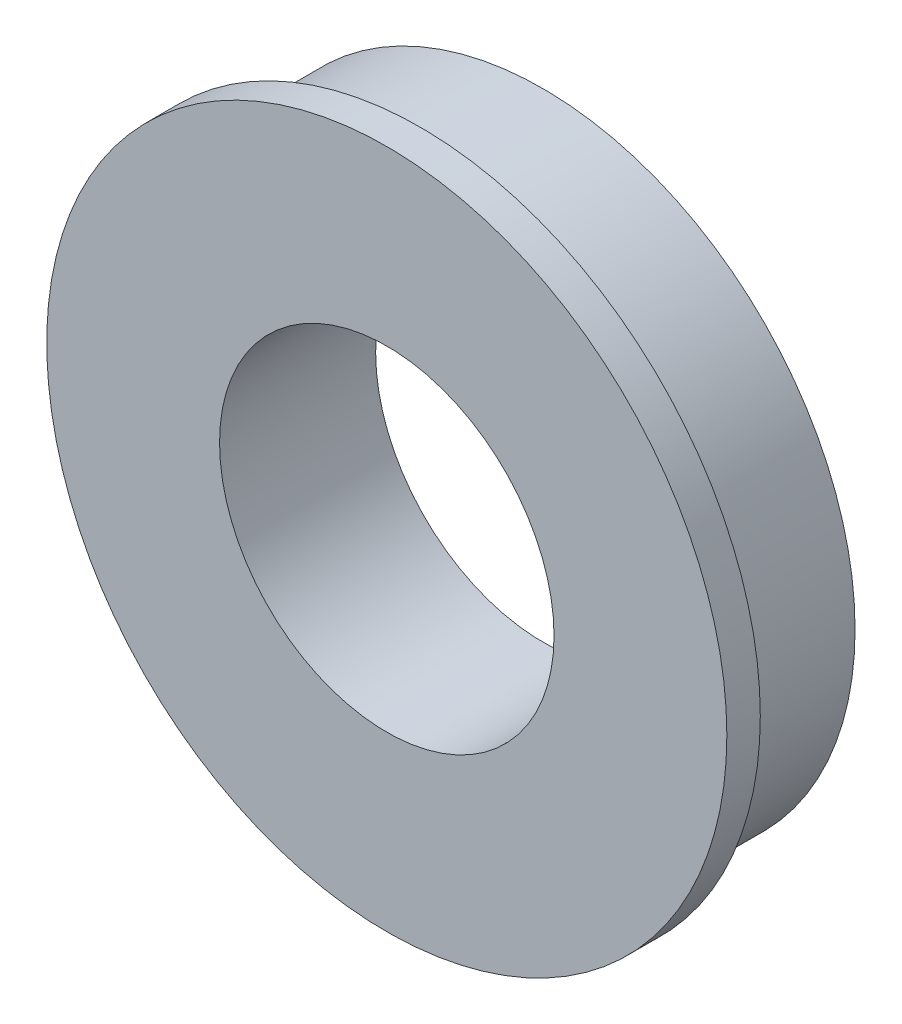
ISO-10303-21;
HEADER;
FILE_DESCRIPTION(('STEP AP214'),'2;1');
FILE_NAME('part.step','',(''),(''),'','','');
FILE_SCHEMA(('AUTOMOTIVE_DESIGN { 1 0 10303 214 1 1 1 1 }'));
ENDSEC;
DATA;
#1=APPLICATION_CONTEXT('core data for automotive mechanical design processes');
#2=APPLICATION_PROTOCOL_DEFINITION('international standard','automotive_design',2000,#1);
#3=PRODUCT_CONTEXT('',#1,'mechanical');
#4=PRODUCT('Part','Part','',(#3));
#5=PRODUCT_RELATED_PRODUCT_CATEGORY('part','',(#4));
#6=PRODUCT_DEFINITION_FORMATION('','',#4);
#7=PRODUCT_DEFINITION_CONTEXT('part definition',#1,'design');
#8=PRODUCT_DEFINITION('design','',#6,#7);
#9=PRODUCT_DEFINITION_SHAPE('','',#8);
#10=(LENGTH_UNIT() NAMED_UNIT(*) SI_UNIT(.MILLI.,.METRE.));
#11=(NAMED_UNIT(*) PLANE_ANGLE_UNIT() SI_UNIT($,.RADIAN.));
#12=(NAMED_UNIT(*) SI_UNIT($,.STERADIAN.) SOLID_ANGLE_UNIT());
#13=UNCERTAINTY_MEASURE_WITH_UNIT(LENGTH_MEASURE(1.E-05),#10,'distance_accuracy_value','');
#14=(GEOMETRIC_REPRESENTATION_CONTEXT(3) GLOBAL_UNCERTAINTY_ASSIGNED_CONTEXT((#13)) GLOBAL_UNIT_ASSIGNED_CONTEXT((#10,
#11,#12)) REPRESENTATION_CONTEXT('',''));
#15=CARTESIAN_POINT('',(0.,0.,0.));
#16=DIRECTION('',(0.,0.,1.));
#17=DIRECTION('',(1.,0.,0.));
#18=AXIS2_PLACEMENT_3D('',#15,#16,#17);
#19=CARTESIAN_POINT('',(0.,0.,5.5));
#20=DIRECTION('',(0.,0.,-1.));
#21=DIRECTION('',(-1.,0.,0.));
#22=AXIS2_PLACEMENT_3D('',#19,#20,#21);
#23=CYLINDRICAL_SURFACE('',#22,14.);
#24=CARTESIAN_POINT('',(0.,0.,5.5));
#25=DIRECTION('',(0.,0.,1.));
#26=DIRECTION('',(1.,0.,0.));
#27=AXIS2_PLACEMENT_3D('',#24,#25,#26);
#28=CIRCLE('',#27,14.);
#29=CARTESIAN_POINT('',(14.,0.,5.5));
#30=VERTEX_POINT('',#29);
#31=EDGE_CURVE('E10',#30,#30,#28,.T.);
#32=ORIENTED_EDGE('',*,*,#31,.F.);
#33=EDGE_LOOP('',(#32));
#34=FACE_BOUND('',#33,.T.);
#35=CARTESIAN_POINT('',(0.,0.,0.));
#36=DIRECTION('',(0.,0.,1.));
#37=DIRECTION('',(1.,0.,0.));
#38=AXIS2_PLACEMENT_3D('',#35,#36,#37);
#39=CIRCLE('',#38,14.);
#40=CARTESIAN_POINT('',(14.,0.,0.));
#41=VERTEX_POINT('',#40);
#42=EDGE_CURVE('E35',#41,#41,#39,.T.);
#43=ORIENTED_EDGE('',*,*,#42,.T.);
#44=EDGE_LOOP('',(#43));
#45=FACE_BOUND('',#44,.T.);
#46=ADVANCED_FACE('F32',(#34,#45),#23,.T.);
#47=CARTESIAN_POINT('',(0.,0.,0.));
#48=DIRECTION('',(0.,0.,1.));
#49=DIRECTION('',(1.,0.,0.));
#50=AXIS2_PLACEMENT_3D('',#47,#48,#49);
#51=PLANE('',#50);
#52=CARTESIAN_POINT('',(0.,0.,0.));
#53=DIRECTION('',(0.,0.,-1.));
#54=DIRECTION('',(-1.,0.,0.));
#55=AXIS2_PLACEMENT_3D('',#52,#53,#54);
#56=CIRCLE('',#55,7.5);
#57=CARTESIAN_POINT('',(-7.5,0.,0.));
#58=VERTEX_POINT('',#57);
#59=EDGE_CURVE('E47',#58,#58,#56,.T.);
#60=ORIENTED_EDGE('',*,*,#59,.F.);
#61=EDGE_LOOP('',(#60));
#62=FACE_BOUND('',#61,.T.);
#63=ORIENTED_EDGE('',*,*,#42,.F.);
#64=EDGE_LOOP('',(#63));
#65=FACE_BOUND('',#64,.T.);
#66=ADVANCED_FACE('F58',(#62,#65),#51,.F.);
#67=CARTESIAN_POINT('',(0.,0.,5.5));
#68=DIRECTION('',(0.,0.,1.));
#69=DIRECTION('',(1.,0.,0.));
#70=AXIS2_PLACEMENT_3D('',#67,#68,#69);
#71=PLANE('',#70);
#72=CARTESIAN_POINT('',(0.,0.,5.5));
#73=DIRECTION('',(0.,0.,1.));
#74=DIRECTION('',(1.,0.,0.));
#75=AXIS2_PLACEMENT_3D('',#72,#73,#74);
#76=CIRCLE('',#75,15.25);
#77=CARTESIAN_POINT('',(15.25,0.,5.5));
#78=VERTEX_POINT('',#77);
#79=EDGE_CURVE('E44',#78,#78,#76,.T.);
#80=ORIENTED_EDGE('',*,*,#79,.F.);
#81=EDGE_LOOP('',(#80));
#82=FACE_BOUND('',#81,.T.);
#83=ORIENTED_EDGE('',*,*,#31,.T.);
#84=EDGE_LOOP('',(#83));
#85=FACE_BOUND('',#84,.T.);
#86=ADVANCED_FACE('F61',(#82,#85),#71,.F.);
#87=CARTESIAN_POINT('',(0.,0.,7.));
#88=DIRECTION('',(0.,0.,-1.));
#89=DIRECTION('',(-1.,0.,0.));
#90=AXIS2_PLACEMENT_3D('',#87,#88,#89);
#91=CYLINDRICAL_SURFACE('',#90,15.25);
#92=CARTESIAN_POINT('',(0.,0.,7.));
#93=DIRECTION('',(0.,0.,1.));
#94=DIRECTION('',(1.,0.,0.));
#95=AXIS2_PLACEMENT_3D('',#92,#93,#94);
#96=CIRCLE('',#95,15.25);
#97=CARTESIAN_POINT('',(15.25,0.,7.));
#98=VERTEX_POINT('',#97);
#99=EDGE_CURVE('E42',#98,#98,#96,.T.);
#100=ORIENTED_EDGE('',*,*,#99,.F.);
#101=EDGE_LOOP('',(#100));
#102=FACE_BOUND('',#101,.T.);
#103=ORIENTED_EDGE('',*,*,#79,.T.);
#104=EDGE_LOOP('',(#103));
#105=FACE_BOUND('',#104,.T.);
#106=ADVANCED_FACE('F80',(#102,#105),#91,.T.);
#107=CARTESIAN_POINT('',(0.,0.,7.));
#108=DIRECTION('',(0.,0.,1.));
#109=DIRECTION('',(1.,0.,0.));
#110=AXIS2_PLACEMENT_3D('',#107,#108,#109);
#111=PLANE('',#110);
#112=CARTESIAN_POINT('',(0.,0.,7.));
#113=DIRECTION('',(0.,0.,1.));
#114=DIRECTION('',(1.,0.,0.));
#115=AXIS2_PLACEMENT_3D('',#112,#113,#114);
#116=CIRCLE('',#115,7.5);
#117=CARTESIAN_POINT('',(-7.5,0.,7.));
#118=VERTEX_POINT('',#117);
#119=EDGE_CURVE('E50',#118,#118,#116,.F.);
#120=ORIENTED_EDGE('',*,*,#119,.T.);
#121=EDGE_LOOP('',(#120));
#122=FACE_BOUND('',#121,.T.);
#123=ORIENTED_EDGE('',*,*,#99,.T.);
#124=EDGE_LOOP('',(#123));
#125=FACE_BOUND('',#124,.T.);
#126=ADVANCED_FACE('F87',(#122,#125),#111,.T.);
#127=CARTESIAN_POINT('',(0.,0.,7.001));
#128=DIRECTION('',(0.,0.,-1.));
#129=DIRECTION('',(-1.,0.,0.));
#130=AXIS2_PLACEMENT_3D('',#127,#128,#129);
#131=CYLINDRICAL_SURFACE('',#130,7.5);
#132=CARTESIAN_POINT('',(-7.5,0.,7.));
#133=CARTESIAN_POINT('',(-7.5,0.,6.92708333333333));
#134=CARTESIAN_POINT('',(-7.5,0.,6.85416666666667));
#135=CARTESIAN_POINT('',(-7.5,0.,6.70833333333333));
#136=CARTESIAN_POINT('',(-7.5,0.,6.63541666666667));
#137=CARTESIAN_POINT('',(-7.5,0.,6.48958333333333));
#138=CARTESIAN_POINT('',(-7.5,0.,6.41666666666667));
#139=CARTESIAN_POINT('',(-7.5,0.,6.27083333333333));
#140=CARTESIAN_POINT('',(-7.5,0.,6.19791666666667));
#141=CARTESIAN_POINT('',(-7.5,0.,6.05208333333333));
#142=CARTESIAN_POINT('',(-7.5,0.,5.97916666666667));
#143=CARTESIAN_POINT('',(-7.5,0.,5.83333333333333));
#144=CARTESIAN_POINT('',(-7.5,0.,5.76041666666667));
#145=CARTESIAN_POINT('',(-7.5,0.,5.61458333333333));
#146=CARTESIAN_POINT('',(-7.5,0.,5.54166666666667));
#147=CARTESIAN_POINT('',(-7.5,0.,5.39583333333333));
#148=CARTESIAN_POINT('',(-7.5,0.,5.32291666666667));
#149=CARTESIAN_POINT('',(-7.5,0.,5.17708333333333));
#150=CARTESIAN_POINT('',(-7.5,0.,5.10416666666667));
#151=CARTESIAN_POINT('',(-7.5,0.,4.95833333333333));
#152=CARTESIAN_POINT('',(-7.5,0.,4.88541666666667));
#153=CARTESIAN_POINT('',(-7.5,0.,4.73958333333333));
#154=CARTESIAN_POINT('',(-7.5,0.,4.66666666666667));
#155=CARTESIAN_POINT('',(-7.5,0.,4.52083333333333));
#156=CARTESIAN_POINT('',(-7.5,0.,4.44791666666667));
#157=CARTESIAN_POINT('',(-7.5,0.,4.30208333333333));
#158=CARTESIAN_POINT('',(-7.5,0.,4.22916666666667));
#159=CARTESIAN_POINT('',(-7.5,0.,4.08333333333333));
#160=CARTESIAN_POINT('',(-7.5,0.,4.01041666666667));
#161=CARTESIAN_POINT('',(-7.5,0.,3.86458333333333));
#162=CARTESIAN_POINT('',(-7.5,0.,3.79166666666667));
#163=CARTESIAN_POINT('',(-7.5,0.,3.64583333333333));
#164=CARTESIAN_POINT('',(-7.5,0.,3.57291666666667));
#165=CARTESIAN_POINT('',(-7.5,0.,3.42708333333333));
#166=CARTESIAN_POINT('',(-7.5,0.,3.35416666666667));
#167=CARTESIAN_POINT('',(-7.5,0.,3.20833333333333));
#168=CARTESIAN_POINT('',(-7.5,0.,3.13541666666667));
#169=CARTESIAN_POINT('',(-7.5,0.,2.98958333333333));
#170=CARTESIAN_POINT('',(-7.5,0.,2.91666666666667));
#171=CARTESIAN_POINT('',(-7.5,0.,2.77083333333333));
#172=CARTESIAN_POINT('',(-7.5,0.,2.69791666666667));
#173=CARTESIAN_POINT('',(-7.5,0.,2.55208333333333));
#174=CARTESIAN_POINT('',(-7.5,0.,2.47916666666667));
#175=CARTESIAN_POINT('',(-7.5,0.,2.33333333333333));
#176=CARTESIAN_POINT('',(-7.5,0.,2.26041666666667));
#177=CARTESIAN_POINT('',(-7.5,0.,2.11458333333333));
#178=CARTESIAN_POINT('',(-7.5,0.,2.04166666666667));
#179=CARTESIAN_POINT('',(-7.5,0.,1.89583333333333));
#180=CARTESIAN_POINT('',(-7.5,0.,1.82291666666667));
#181=CARTESIAN_POINT('',(-7.5,0.,1.67708333333333));
#182=CARTESIAN_POINT('',(-7.5,0.,1.60416666666667));
#183=CARTESIAN_POINT('',(-7.5,0.,1.45833333333333));
#184=CARTESIAN_POINT('',(-7.5,0.,1.38541666666667));
#185=CARTESIAN_POINT('',(-7.5,0.,1.23958333333333));
#186=CARTESIAN_POINT('',(-7.5,0.,1.16666666666667));
#187=CARTESIAN_POINT('',(-7.5,0.,1.02083333333333));
#188=CARTESIAN_POINT('',(-7.5,0.,0.947916666666667));
#189=CARTESIAN_POINT('',(-7.5,0.,0.802083333333333));
#190=CARTESIAN_POINT('',(-7.5,0.,0.729166666666666));
#191=CARTESIAN_POINT('',(-7.5,0.,0.583333333333333));
#192=CARTESIAN_POINT('',(-7.5,0.,0.510416666666667));
#193=CARTESIAN_POINT('',(-7.5,0.,0.364583333333334));
#194=CARTESIAN_POINT('',(-7.5,0.,0.291666666666667));
#195=CARTESIAN_POINT('',(-7.5,0.,0.145833333333333));
#196=CARTESIAN_POINT('',(-7.5,0.,0.0729166666666666));
#197=CARTESIAN_POINT('',(-7.5,0.,0.));
#198=B_SPLINE_CURVE_WITH_KNOTS('',3,(#132,#133,#134,#135,#136,#137,#138,#139,#140,#141,#142,
#143,#144,#145,#146,#147,#148,#149,#150,#151,#152,#153,#154,#155,#156,#157,#158,#159,#160,#161,
#162,#163,#164,#165,#166,#167,#168,#169,#170,#171,#172,#173,#174,#175,#176,#177,#178,#179,#180,
#181,#182,#183,#184,#185,#186,#187,#188,#189,#190,#191,#192,#193,#194,#195,#196,#197),
.UNSPECIFIED.,.F.,.F.,(4,2,2,2,2,2,2,2,2,2,2,2,2,2,2,2,2,2,2,2,2,2,2,2,2,2,2,2,2,2,2,2,4),(0.,
0.218749999999999,0.4375,0.65625,0.874999999999999,1.09375,1.3125,1.53125,1.75,1.96875,2.1875,
2.40625,2.625,2.84375,3.0625,3.28125,3.5,3.71875,3.9375,4.15625,4.375,4.59375,4.8125,5.03125,
5.25,5.46875,5.6875,5.90625,6.125,6.34375,6.5625,6.78125,7.),.UNSPECIFIED.);
#199=EDGE_CURVE('BSEAM56',#118,#58,#198,.T.);
#200=ORIENTED_EDGE('',*,*,#119,.F.);
#201=ORIENTED_EDGE('',*,*,#59,.T.);
#202=ORIENTED_EDGE('',*,*,#199,.T.);
#203=ORIENTED_EDGE('',*,*,#199,.F.);
#204=EDGE_LOOP('',(#200,#202,#201,#203));
#205=FACE_BOUND('',#204,.T.);
#206=ADVANCED_FACE('F56',(#205),#131,.F.);
#207=CLOSED_SHELL('',(#46,#66,#86,#106,#126,#206));
#208=MANIFOLD_SOLID_BREP('B2',#207);
#209=ADVANCED_BREP_SHAPE_REPRESENTATION('',(#18,#208),#14);
#210=SHAPE_DEFINITION_REPRESENTATION(#9,#209);
ENDSEC;
END-ISO-10303-21;
